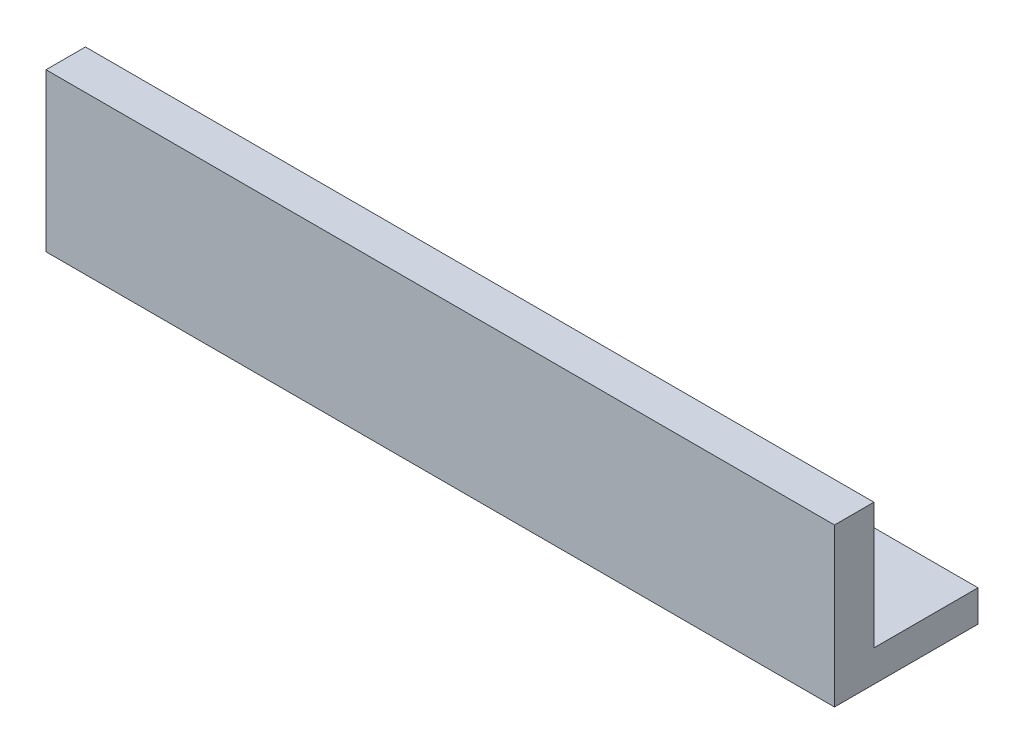
ISO-10303-21;
HEADER;
FILE_DESCRIPTION(('STEP AP214'),'2;1');
FILE_NAME('part.step','',(''),(''),'','','');
FILE_SCHEMA(('AUTOMOTIVE_DESIGN { 1 0 10303 214 1 1 1 1 }'));
ENDSEC;
DATA;
#1=APPLICATION_CONTEXT('core data for automotive mechanical design processes');
#2=APPLICATION_PROTOCOL_DEFINITION('international standard','automotive_design',2000,#1);
#3=PRODUCT_CONTEXT('',#1,'mechanical');
#4=PRODUCT('Part','Part','',(#3));
#5=PRODUCT_RELATED_PRODUCT_CATEGORY('part','',(#4));
#6=PRODUCT_DEFINITION_FORMATION('','',#4);
#7=PRODUCT_DEFINITION_CONTEXT('part definition',#1,'design');
#8=PRODUCT_DEFINITION('design','',#6,#7);
#9=PRODUCT_DEFINITION_SHAPE('','',#8);
#10=(LENGTH_UNIT() NAMED_UNIT(*) SI_UNIT(.MILLI.,.METRE.));
#11=(NAMED_UNIT(*) PLANE_ANGLE_UNIT() SI_UNIT($,.RADIAN.));
#12=(NAMED_UNIT(*) SI_UNIT($,.STERADIAN.) SOLID_ANGLE_UNIT());
#13=UNCERTAINTY_MEASURE_WITH_UNIT(LENGTH_MEASURE(1.E-05),#10,'distance_accuracy_value','');
#14=(GEOMETRIC_REPRESENTATION_CONTEXT(3) GLOBAL_UNCERTAINTY_ASSIGNED_CONTEXT((#13)) GLOBAL_UNIT_ASSIGNED_CONTEXT((#10,
#11,#12)) REPRESENTATION_CONTEXT('',''));
#15=CARTESIAN_POINT('',(0.,0.,0.));
#16=DIRECTION('',(0.,0.,1.));
#17=DIRECTION('',(1.,0.,0.));
#18=AXIS2_PLACEMENT_3D('',#15,#16,#17);
#19=CARTESIAN_POINT('',(0.,2.,0.));
#20=DIRECTION('',(0.,-1.,0.));
#21=DIRECTION('',(0.,0.,-1.));
#22=AXIS2_PLACEMENT_3D('',#19,#20,#21);
#23=PLANE('',#22);
#24=CARTESIAN_POINT('',(6.25,2.,-5.3));
#25=DIRECTION('',(0.,1.,0.));
#26=DIRECTION('',(0.,0.,1.));
#27=AXIS2_PLACEMENT_3D('',#24,#25,#26);
#28=CIRCLE('',#27,1.8);
#29=CARTESIAN_POINT('',(6.25,2.,-3.5));
#30=VERTEX_POINT('',#29);
#31=EDGE_CURVE('E168',#30,#30,#28,.T.);
#32=ORIENTED_EDGE('',*,*,#31,.F.);
#33=EDGE_LOOP('',(#32));
#34=FACE_BOUND('',#33,.T.);
#35=DIRECTION('',(-1.,0.,0.));
#36=VECTOR('',#35,1.);
#37=CARTESIAN_POINT('',(0.,2.,-2.));
#38=LINE('',#37,#36);
#39=CARTESIAN_POINT('',(12.5,2.,-2.));
#40=VERTEX_POINT('',#39);
#41=CARTESIAN_POINT('',(0.,2.,-2.));
#42=VERTEX_POINT('',#41);
#43=EDGE_CURVE('E39',#40,#42,#38,.T.);
#44=ORIENTED_EDGE('',*,*,#43,.F.);
#45=DIRECTION('',(0.,0.,1.));
#46=VECTOR('',#45,1.);
#47=CARTESIAN_POINT('',(12.5,2.,-8.6));
#48=LINE('',#47,#46);
#49=CARTESIAN_POINT('',(12.5,2.,-8.6));
#50=VERTEX_POINT('',#49);
#51=EDGE_CURVE('E158',#50,#40,#48,.T.);
#52=ORIENTED_EDGE('',*,*,#51,.F.);
#53=DIRECTION('',(-1.,0.,0.));
#54=VECTOR('',#53,1.);
#55=CARTESIAN_POINT('',(0.,2.,-8.6));
#56=LINE('',#55,#54);
#57=CARTESIAN_POINT('',(0.,2.,-8.6));
#58=VERTEX_POINT('',#57);
#59=EDGE_CURVE('E62',#50,#58,#56,.T.);
#60=ORIENTED_EDGE('',*,*,#59,.T.);
#61=DIRECTION('',(0.,0.,1.));
#62=VECTOR('',#61,1.);
#63=CARTESIAN_POINT('',(0.,2.,0.));
#64=LINE('',#63,#62);
#65=EDGE_CURVE('E95',#58,#42,#64,.T.);
#66=ORIENTED_EDGE('',*,*,#65,.T.);
#67=EDGE_LOOP('',(#44,#52,#60,#66));
#68=FACE_BOUND('',#67,.T.);
#69=ADVANCED_FACE('F35',(#34,#68),#23,.F.);
#70=CARTESIAN_POINT('',(0.,2.,-8.6));
#71=DIRECTION('',(0.,0.,1.));
#72=DIRECTION('',(1.,0.,0.));
#73=AXIS2_PLACEMENT_3D('',#70,#71,#72);
#74=PLANE('',#73);
#75=ORIENTED_EDGE('',*,*,#59,.F.);
#76=DIRECTION('',(0.,1.,0.));
#77=VECTOR('',#76,1.);
#78=CARTESIAN_POINT('',(12.5,-6.,-8.6));
#79=LINE('',#78,#77);
#80=CARTESIAN_POINT('',(12.5,0.,-8.6));
#81=VERTEX_POINT('',#80);
#82=EDGE_CURVE('E81',#81,#50,#79,.T.);
#83=ORIENTED_EDGE('',*,*,#82,.F.);
#84=DIRECTION('',(-1.,0.,0.));
#85=VECTOR('',#84,1.);
#86=CARTESIAN_POINT('',(0.,0.,-8.6));
#87=LINE('',#86,#85);
#88=CARTESIAN_POINT('',(0.,0.,-8.6));
#89=VERTEX_POINT('',#88);
#90=EDGE_CURVE('E75',#81,#89,#87,.T.);
#91=ORIENTED_EDGE('',*,*,#90,.T.);
#92=DIRECTION('',(0.,-1.,0.));
#93=VECTOR('',#92,1.);
#94=CARTESIAN_POINT('',(0.,2.,-8.6));
#95=LINE('',#94,#93);
#96=EDGE_CURVE('E45',#58,#89,#95,.T.);
#97=ORIENTED_EDGE('',*,*,#96,.F.);
#98=EDGE_LOOP('',(#75,#83,#91,#97));
#99=FACE_BOUND('',#98,.T.);
#100=ADVANCED_FACE('F77',(#99),#74,.F.);
#101=CARTESIAN_POINT('',(43.75,2.,-5.3));
#102=DIRECTION('',(0.,1.,0.));
#103=DIRECTION('',(0.,0.,1.));
#104=AXIS2_PLACEMENT_3D('',#101,#102,#103);
#105=CIRCLE('',#104,1.8);
#106=CARTESIAN_POINT('',(43.75,2.,-3.5));
#107=VERTEX_POINT('',#106);
#108=EDGE_CURVE('E162',#107,#107,#105,.T.);
#109=ORIENTED_EDGE('',*,*,#108,.F.);
#110=EDGE_LOOP('',(#109));
#111=FACE_BOUND('',#110,.T.);
#112=CARTESIAN_POINT('',(50.,2.,-8.6));
#113=VERTEX_POINT('',#112);
#114=CARTESIAN_POINT('',(37.5,2.,-8.6));
#115=VERTEX_POINT('',#114);
#116=EDGE_CURVE('E96',#113,#115,#56,.T.);
#117=ORIENTED_EDGE('',*,*,#116,.T.);
#118=DIRECTION('',(0.,0.,-1.));
#119=VECTOR('',#118,1.);
#120=CARTESIAN_POINT('',(37.5,2.,-8.6));
#121=LINE('',#120,#119);
#122=CARTESIAN_POINT('',(37.5,2.,-2.));
#123=VERTEX_POINT('',#122);
#124=EDGE_CURVE('E154',#123,#115,#121,.T.);
#125=ORIENTED_EDGE('',*,*,#124,.F.);
#126=CARTESIAN_POINT('',(50.,2.,-2.));
#127=VERTEX_POINT('',#126);
#128=EDGE_CURVE('E53',#127,#123,#38,.T.);
#129=ORIENTED_EDGE('',*,*,#128,.F.);
#130=DIRECTION('',(0.,0.,-1.));
#131=VECTOR('',#130,1.);
#132=CARTESIAN_POINT('',(50.,2.,0.));
#133=LINE('',#132,#131);
#134=EDGE_CURVE('E116',#127,#113,#133,.T.);
#135=ORIENTED_EDGE('',*,*,#134,.T.);
#136=EDGE_LOOP('',(#117,#125,#129,#135));
#137=FACE_BOUND('',#136,.T.);
#138=ADVANCED_FACE('F218',(#111,#137),#23,.F.);
#139=CARTESIAN_POINT('',(0.,2.,0.));
#140=DIRECTION('',(1.,0.,0.));
#141=DIRECTION('',(0.,0.,-1.));
#142=AXIS2_PLACEMENT_3D('',#139,#140,#141);
#143=PLANE('',#142);
#144=DIRECTION('',(0.,0.,1.));
#145=VECTOR('',#144,1.);
#146=CARTESIAN_POINT('',(0.,0.,0.));
#147=LINE('',#146,#145);
#148=CARTESIAN_POINT('',(0.,0.,0.5));
#149=VERTEX_POINT('',#148);
#150=EDGE_CURVE('E92',#89,#149,#147,.T.);
#151=ORIENTED_EDGE('',*,*,#150,.T.);
#152=DIRECTION('',(0.,-1.,0.));
#153=VECTOR('',#152,1.);
#154=CARTESIAN_POINT('',(0.,0.,0.5));
#155=LINE('',#154,#153);
#156=CARTESIAN_POINT('',(0.,10.,0.5));
#157=VERTEX_POINT('',#156);
#158=EDGE_CURVE('E171',#157,#149,#155,.T.);
#159=ORIENTED_EDGE('',*,*,#158,.F.);
#160=DIRECTION('',(0.,0.,1.));
#161=VECTOR('',#160,1.);
#162=CARTESIAN_POINT('',(0.,10.,0.));
#163=LINE('',#162,#161);
#164=CARTESIAN_POINT('',(0.,10.,-2.));
#165=VERTEX_POINT('',#164);
#166=EDGE_CURVE('E126',#165,#157,#163,.T.);
#167=ORIENTED_EDGE('',*,*,#166,.F.);
#168=DIRECTION('',(0.,-1.,0.));
#169=VECTOR('',#168,1.);
#170=CARTESIAN_POINT('',(0.,10.,-2.));
#171=LINE('',#170,#169);
#172=EDGE_CURVE('E108',#165,#42,#171,.T.);
#173=ORIENTED_EDGE('',*,*,#172,.T.);
#174=ORIENTED_EDGE('',*,*,#65,.F.);
#175=ORIENTED_EDGE('',*,*,#96,.T.);
#176=EDGE_LOOP('',(#151,#159,#167,#173,#174,#175));
#177=FACE_BOUND('',#176,.T.);
#178=ADVANCED_FACE('F37',(#177),#143,.F.);
#179=CARTESIAN_POINT('',(50.,2.,0.));
#180=DIRECTION('',(-1.,0.,0.));
#181=DIRECTION('',(0.,0.,1.));
#182=AXIS2_PLACEMENT_3D('',#179,#180,#181);
#183=PLANE('',#182);
#184=DIRECTION('',(0.,0.,-1.));
#185=VECTOR('',#184,1.);
#186=CARTESIAN_POINT('',(50.,0.,0.));
#187=LINE('',#186,#185);
#188=CARTESIAN_POINT('',(50.,0.,0.5));
#189=VERTEX_POINT('',#188);
#190=CARTESIAN_POINT('',(50.,0.,-8.6));
#191=VERTEX_POINT('',#190);
#192=EDGE_CURVE('E86',#189,#191,#187,.T.);
#193=ORIENTED_EDGE('',*,*,#192,.T.);
#194=DIRECTION('',(0.,-1.,0.));
#195=VECTOR('',#194,1.);
#196=CARTESIAN_POINT('',(50.,2.,-8.6));
#197=LINE('',#196,#195);
#198=EDGE_CURVE('E11',#113,#191,#197,.T.);
#199=ORIENTED_EDGE('',*,*,#198,.F.);
#200=ORIENTED_EDGE('',*,*,#134,.F.);
#201=DIRECTION('',(0.,-1.,0.));
#202=VECTOR('',#201,1.);
#203=CARTESIAN_POINT('',(50.,10.,-2.));
#204=LINE('',#203,#202);
#205=CARTESIAN_POINT('',(50.,10.,-2.));
#206=VERTEX_POINT('',#205);
#207=EDGE_CURVE('E104',#206,#127,#204,.T.);
#208=ORIENTED_EDGE('',*,*,#207,.F.);
#209=DIRECTION('',(0.,0.,-1.));
#210=VECTOR('',#209,1.);
#211=CARTESIAN_POINT('',(50.,10.,0.));
#212=LINE('',#211,#210);
#213=CARTESIAN_POINT('',(50.,10.,0.5));
#214=VERTEX_POINT('',#213);
#215=EDGE_CURVE('E134',#214,#206,#212,.T.);
#216=ORIENTED_EDGE('',*,*,#215,.F.);
#217=DIRECTION('',(0.,1.,0.));
#218=VECTOR('',#217,1.);
#219=CARTESIAN_POINT('',(50.,10.,0.5));
#220=LINE('',#219,#218);
#221=EDGE_CURVE('E178',#189,#214,#220,.T.);
#222=ORIENTED_EDGE('',*,*,#221,.F.);
#223=EDGE_LOOP('',(#193,#199,#200,#208,#216,#222));
#224=FACE_BOUND('',#223,.T.);
#225=ADVANCED_FACE('F221',(#224),#183,.F.);
#226=CARTESIAN_POINT('',(37.5,0.,-8.6));
#227=VERTEX_POINT('',#226);
#228=EDGE_CURVE('E85',#191,#227,#87,.T.);
#229=ORIENTED_EDGE('',*,*,#228,.T.);
#230=DIRECTION('',(0.,1.,0.));
#231=VECTOR('',#230,1.);
#232=CARTESIAN_POINT('',(37.5,-6.,-8.6));
#233=LINE('',#232,#231);
#234=EDGE_CURVE('E151',#227,#115,#233,.T.);
#235=ORIENTED_EDGE('',*,*,#234,.T.);
#236=ORIENTED_EDGE('',*,*,#116,.F.);
#237=ORIENTED_EDGE('',*,*,#198,.T.);
#238=EDGE_LOOP('',(#229,#235,#236,#237));
#239=FACE_BOUND('',#238,.T.);
#240=ADVANCED_FACE('F216',(#239),#74,.F.);
#241=CARTESIAN_POINT('',(0.,0.,0.));
#242=DIRECTION('',(0.,-1.,0.));
#243=DIRECTION('',(0.,0.,-1.));
#244=AXIS2_PLACEMENT_3D('',#241,#242,#243);
#245=PLANE('',#244);
#246=CARTESIAN_POINT('',(6.25,0.,-5.3));
#247=DIRECTION('',(0.,1.,0.));
#248=DIRECTION('',(0.,0.,1.));
#249=AXIS2_PLACEMENT_3D('',#246,#247,#248);
#250=CIRCLE('',#249,1.8);
#251=CARTESIAN_POINT('',(6.25,0.,-3.5));
#252=VERTEX_POINT('',#251);
#253=EDGE_CURVE('E165',#252,#252,#250,.T.);
#254=ORIENTED_EDGE('',*,*,#253,.T.);
#255=EDGE_LOOP('',(#254));
#256=FACE_BOUND('',#255,.T.);
#257=DIRECTION('',(0.,0.,-1.));
#258=VECTOR('',#257,1.);
#259=CARTESIAN_POINT('',(12.5,0.,0.));
#260=LINE('',#259,#258);
#261=CARTESIAN_POINT('',(12.5,0.,-2.));
#262=VERTEX_POINT('',#261);
#263=EDGE_CURVE('E145',#262,#81,#260,.T.);
#264=ORIENTED_EDGE('',*,*,#263,.F.);
#265=DIRECTION('',(1.,0.,0.));
#266=VECTOR('',#265,1.);
#267=CARTESIAN_POINT('',(12.5,0.,-2.));
#268=LINE('',#267,#266);
#269=CARTESIAN_POINT('',(37.5,0.,-2.));
#270=VERTEX_POINT('',#269);
#271=EDGE_CURVE('E185',#262,#270,#268,.T.);
#272=ORIENTED_EDGE('',*,*,#271,.T.);
#273=DIRECTION('',(0.,0.,1.));
#274=VECTOR('',#273,1.);
#275=CARTESIAN_POINT('',(37.5,0.,0.));
#276=LINE('',#275,#274);
#277=EDGE_CURVE('E148',#227,#270,#276,.T.);
#278=ORIENTED_EDGE('',*,*,#277,.F.);
#279=ORIENTED_EDGE('',*,*,#228,.F.);
#280=ORIENTED_EDGE('',*,*,#192,.F.);
#281=DIRECTION('',(1.,0.,0.));
#282=VECTOR('',#281,1.);
#283=CARTESIAN_POINT('',(50.,0.,0.5));
#284=LINE('',#283,#282);
#285=EDGE_CURVE('E103',#149,#189,#284,.T.);
#286=ORIENTED_EDGE('',*,*,#285,.F.);
#287=ORIENTED_EDGE('',*,*,#150,.F.);
#288=ORIENTED_EDGE('',*,*,#90,.F.);
#289=EDGE_LOOP('',(#264,#272,#278,#279,#280,#286,#287,#288));
#290=FACE_BOUND('',#289,.T.);
#291=CARTESIAN_POINT('',(43.75,0.,-5.3));
#292=DIRECTION('',(0.,1.,0.));
#293=DIRECTION('',(0.,0.,1.));
#294=AXIS2_PLACEMENT_3D('',#291,#292,#293);
#295=CIRCLE('',#294,1.8);
#296=CARTESIAN_POINT('',(43.75,0.,-3.5));
#297=VERTEX_POINT('',#296);
#298=EDGE_CURVE('E161',#297,#297,#295,.T.);
#299=ORIENTED_EDGE('',*,*,#298,.T.);
#300=EDGE_LOOP('',(#299));
#301=FACE_BOUND('',#300,.T.);
#302=ADVANCED_FACE('F99',(#256,#290,#301),#245,.T.);
#303=CARTESIAN_POINT('',(0.,10.,-2.));
#304=DIRECTION('',(0.,0.,1.));
#305=DIRECTION('',(1.,0.,0.));
#306=AXIS2_PLACEMENT_3D('',#303,#304,#305);
#307=PLANE('',#306);
#308=ORIENTED_EDGE('',*,*,#128,.T.);
#309=DIRECTION('',(0.,1.,0.));
#310=VECTOR('',#309,1.);
#311=CARTESIAN_POINT('',(37.5,0.,-2.));
#312=LINE('',#311,#310);
#313=EDGE_CURVE('E182',#270,#123,#312,.T.);
#314=ORIENTED_EDGE('',*,*,#313,.F.);
#315=ORIENTED_EDGE('',*,*,#271,.F.);
#316=DIRECTION('',(0.,-1.,0.));
#317=VECTOR('',#316,1.);
#318=CARTESIAN_POINT('',(12.5,0.,-2.));
#319=LINE('',#318,#317);
#320=EDGE_CURVE('E188',#40,#262,#319,.T.);
#321=ORIENTED_EDGE('',*,*,#320,.F.);
#322=ORIENTED_EDGE('',*,*,#43,.T.);
#323=ORIENTED_EDGE('',*,*,#172,.F.);
#324=DIRECTION('',(-1.,0.,0.));
#325=VECTOR('',#324,1.);
#326=CARTESIAN_POINT('',(0.,10.,-2.));
#327=LINE('',#326,#325);
#328=EDGE_CURVE('E122',#206,#165,#327,.T.);
#329=ORIENTED_EDGE('',*,*,#328,.F.);
#330=ORIENTED_EDGE('',*,*,#207,.T.);
#331=EDGE_LOOP('',(#308,#314,#315,#321,#322,#323,#329,#330));
#332=FACE_BOUND('',#331,.T.);
#333=ADVANCED_FACE('F237',(#332),#307,.F.);
#334=CARTESIAN_POINT('',(0.,10.,0.));
#335=DIRECTION('',(0.,-1.,0.));
#336=DIRECTION('',(0.,0.,-1.));
#337=AXIS2_PLACEMENT_3D('',#334,#335,#336);
#338=PLANE('',#337);
#339=ORIENTED_EDGE('',*,*,#166,.T.);
#340=DIRECTION('',(-1.,0.,0.));
#341=VECTOR('',#340,1.);
#342=CARTESIAN_POINT('',(0.,10.,0.5));
#343=LINE('',#342,#341);
#344=EDGE_CURVE('E175',#214,#157,#343,.T.);
#345=ORIENTED_EDGE('',*,*,#344,.F.);
#346=ORIENTED_EDGE('',*,*,#215,.T.);
#347=ORIENTED_EDGE('',*,*,#328,.T.);
#348=EDGE_LOOP('',(#339,#345,#346,#347));
#349=FACE_BOUND('',#348,.T.);
#350=ADVANCED_FACE('F275',(#349),#338,.F.);
#351=CARTESIAN_POINT('',(12.5,-6.,-8.6));
#352=DIRECTION('',(-1.,0.,0.));
#353=DIRECTION('',(0.,0.,1.));
#354=AXIS2_PLACEMENT_3D('',#351,#352,#353);
#355=PLANE('',#354);
#356=ORIENTED_EDGE('',*,*,#51,.T.);
#357=ORIENTED_EDGE('',*,*,#320,.T.);
#358=ORIENTED_EDGE('',*,*,#263,.T.);
#359=ORIENTED_EDGE('',*,*,#82,.T.);
#360=EDGE_LOOP('',(#356,#357,#358,#359));
#361=FACE_BOUND('',#360,.T.);
#362=ADVANCED_FACE('F193',(#361),#355,.F.);
#363=CARTESIAN_POINT('',(37.5,-6.,-8.6));
#364=DIRECTION('',(1.,0.,0.));
#365=DIRECTION('',(0.,0.,-1.));
#366=AXIS2_PLACEMENT_3D('',#363,#364,#365);
#367=PLANE('',#366);
#368=ORIENTED_EDGE('',*,*,#277,.T.);
#369=ORIENTED_EDGE('',*,*,#313,.T.);
#370=ORIENTED_EDGE('',*,*,#124,.T.);
#371=ORIENTED_EDGE('',*,*,#234,.F.);
#372=EDGE_LOOP('',(#368,#369,#370,#371));
#373=FACE_BOUND('',#372,.T.);
#374=ADVANCED_FACE('F209',(#373),#367,.F.);
#375=CARTESIAN_POINT('',(43.75,0.,-5.3));
#376=DIRECTION('',(0.,1.,0.));
#377=DIRECTION('',(0.,0.,1.));
#378=AXIS2_PLACEMENT_3D('',#375,#376,#377);
#379=CYLINDRICAL_SURFACE('',#378,1.8);
#380=ORIENTED_EDGE('',*,*,#298,.F.);
#381=EDGE_LOOP('',(#380));
#382=FACE_BOUND('',#381,.T.);
#383=ORIENTED_EDGE('',*,*,#108,.T.);
#384=EDGE_LOOP('',(#383));
#385=FACE_BOUND('',#384,.T.);
#386=ADVANCED_FACE('F257',(#382,#385),#379,.F.);
#387=CARTESIAN_POINT('',(6.25,0.,-5.3));
#388=DIRECTION('',(0.,1.,0.));
#389=DIRECTION('',(0.,0.,1.));
#390=AXIS2_PLACEMENT_3D('',#387,#388,#389);
#391=CYLINDRICAL_SURFACE('',#390,1.8);
#392=ORIENTED_EDGE('',*,*,#253,.F.);
#393=EDGE_LOOP('',(#392));
#394=FACE_BOUND('',#393,.T.);
#395=ORIENTED_EDGE('',*,*,#31,.T.);
#396=EDGE_LOOP('',(#395));
#397=FACE_BOUND('',#396,.T.);
#398=ADVANCED_FACE('F259',(#394,#397),#391,.F.);
#399=CARTESIAN_POINT('',(0.,0.,0.5));
#400=DIRECTION('',(0.,0.,-1.));
#401=DIRECTION('',(-1.,0.,0.));
#402=AXIS2_PLACEMENT_3D('',#399,#400,#401);
#403=PLANE('',#402);
#404=ORIENTED_EDGE('',*,*,#158,.T.);
#405=ORIENTED_EDGE('',*,*,#285,.T.);
#406=ORIENTED_EDGE('',*,*,#221,.T.);
#407=ORIENTED_EDGE('',*,*,#344,.T.);
#408=EDGE_LOOP('',(#404,#405,#406,#407));
#409=FACE_BOUND('',#408,.T.);
#410=ADVANCED_FACE('F227',(#409),#403,.F.);
#411=CLOSED_SHELL('',(#69,#100,#138,#178,#225,#240,#302,#333,#350,#362,#374,#386,#398,#410));
#412=MANIFOLD_SOLID_BREP('B2',#411);
#413=ADVANCED_BREP_SHAPE_REPRESENTATION('',(#18,#412),#14);
#414=SHAPE_DEFINITION_REPRESENTATION(#9,#413);
ENDSEC;
END-ISO-10303-21;
